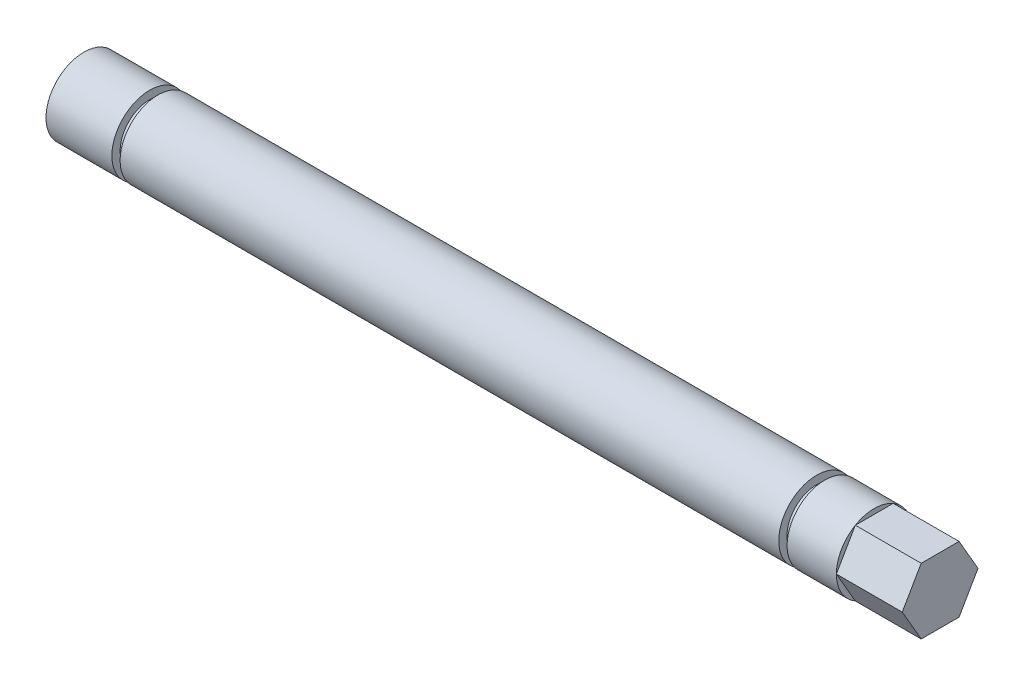
ISO-10303-21;
HEADER;
FILE_DESCRIPTION(('STEP AP214'),'2;1');
FILE_NAME('part.step','',(''),(''),'','','');
FILE_SCHEMA(('AUTOMOTIVE_DESIGN { 1 0 10303 214 1 1 1 1 }'));
ENDSEC;
DATA;
#1=APPLICATION_CONTEXT('core data for automotive mechanical design processes');
#2=APPLICATION_PROTOCOL_DEFINITION('international standard','automotive_design',2000,#1);
#3=PRODUCT_CONTEXT('',#1,'mechanical');
#4=PRODUCT('Part','Part','',(#3));
#5=PRODUCT_RELATED_PRODUCT_CATEGORY('part','',(#4));
#6=PRODUCT_DEFINITION_FORMATION('','',#4);
#7=PRODUCT_DEFINITION_CONTEXT('part definition',#1,'design');
#8=PRODUCT_DEFINITION('design','',#6,#7);
#9=PRODUCT_DEFINITION_SHAPE('','',#8);
#10=(LENGTH_UNIT() NAMED_UNIT(*) SI_UNIT(.MILLI.,.METRE.));
#11=(NAMED_UNIT(*) PLANE_ANGLE_UNIT() SI_UNIT($,.RADIAN.));
#12=(NAMED_UNIT(*) SI_UNIT($,.STERADIAN.) SOLID_ANGLE_UNIT());
#13=UNCERTAINTY_MEASURE_WITH_UNIT(LENGTH_MEASURE(1.E-05),#10,'distance_accuracy_value','');
#14=(GEOMETRIC_REPRESENTATION_CONTEXT(3) GLOBAL_UNCERTAINTY_ASSIGNED_CONTEXT((#13)) GLOBAL_UNIT_ASSIGNED_CONTEXT((#10,
#11,#12)) REPRESENTATION_CONTEXT('',''));
#15=CARTESIAN_POINT('',(0.,0.,0.));
#16=DIRECTION('',(0.,0.,1.));
#17=DIRECTION('',(1.,0.,0.));
#18=AXIS2_PLACEMENT_3D('',#15,#16,#17);
#19=CARTESIAN_POINT('',(165.1,0.,0.));
#20=DIRECTION('',(-1.,0.,0.));
#21=DIRECTION('',(0.,0.,1.));
#22=AXIS2_PLACEMENT_3D('',#19,#20,#21);
#23=CYLINDRICAL_SURFACE('',#22,7.3025);
#24=CARTESIAN_POINT('',(142.8877,0.,0.));
#25=DIRECTION('',(-1.,0.,0.));
#26=DIRECTION('',(0.,0.,1.));
#27=AXIS2_PLACEMENT_3D('',#24,#25,#26);
#28=CIRCLE('',#27,7.3025);
#29=CARTESIAN_POINT('',(142.8877,0.,7.3025));
#30=VERTEX_POINT('',#29);
#31=EDGE_CURVE('E146',#30,#30,#28,.T.);
#32=ORIENTED_EDGE('',*,*,#31,.F.);
#33=EDGE_LOOP('',(#32));
#34=FACE_BOUND('',#33,.T.);
#35=CARTESIAN_POINT('',(152.4,0.,0.));
#36=DIRECTION('',(1.,0.,0.));
#37=DIRECTION('',(0.,0.,-1.));
#38=AXIS2_PLACEMENT_3D('',#35,#36,#37);
#39=CIRCLE('',#38,7.3025);
#40=CARTESIAN_POINT('',(152.4,0.,-7.3025));
#41=VERTEX_POINT('',#40);
#42=CARTESIAN_POINT('',(152.4,6.32415051113586,-3.65125));
#43=VERTEX_POINT('',#42);
#44=EDGE_CURVE('E12',#41,#43,#39,.T.);
#45=ORIENTED_EDGE('',*,*,#44,.F.);
#46=CARTESIAN_POINT('',(152.4,-6.32415051113586,-3.65125));
#47=VERTEX_POINT('',#46);
#48=EDGE_CURVE('E44',#47,#41,#39,.T.);
#49=ORIENTED_EDGE('',*,*,#48,.F.);
#50=CARTESIAN_POINT('',(152.4,-6.32415051113586,3.65125));
#51=VERTEX_POINT('',#50);
#52=EDGE_CURVE('E97',#51,#47,#39,.T.);
#53=ORIENTED_EDGE('',*,*,#52,.F.);
#54=CARTESIAN_POINT('',(152.4,0.,7.3025));
#55=VERTEX_POINT('',#54);
#56=EDGE_CURVE('E129',#55,#51,#39,.T.);
#57=ORIENTED_EDGE('',*,*,#56,.F.);
#58=CARTESIAN_POINT('',(152.4,6.32415051113586,3.65125));
#59=VERTEX_POINT('',#58);
#60=EDGE_CURVE('E125',#59,#55,#39,.T.);
#61=ORIENTED_EDGE('',*,*,#60,.F.);
#62=EDGE_CURVE('E39',#43,#59,#39,.T.);
#63=ORIENTED_EDGE('',*,*,#62,.F.);
#64=EDGE_LOOP('',(#45,#49,#53,#57,#61,#63));
#65=FACE_BOUND('',#64,.T.);
#66=ADVANCED_FACE('F35',(#34,#65),#23,.T.);
#67=CARTESIAN_POINT('',(0.,0.,0.));
#68=DIRECTION('',(1.,0.,0.));
#69=DIRECTION('',(0.,0.,-1.));
#70=AXIS2_PLACEMENT_3D('',#67,#68,#69);
#71=CIRCLE('',#70,7.3025);
#72=CARTESIAN_POINT('',(0.,0.,-7.3025));
#73=VERTEX_POINT('',#72);
#74=EDGE_CURVE('E128',#73,#73,#71,.T.);
#75=ORIENTED_EDGE('',*,*,#74,.T.);
#76=EDGE_LOOP('',(#75));
#77=FACE_BOUND('',#76,.T.);
#78=CARTESIAN_POINT('',(12.7,0.,0.));
#79=DIRECTION('',(-1.,0.,0.));
#80=DIRECTION('',(0.,0.,1.));
#81=AXIS2_PLACEMENT_3D('',#78,#79,#80);
#82=CIRCLE('',#81,7.3025);
#83=CARTESIAN_POINT('',(12.7,0.,7.3025));
#84=VERTEX_POINT('',#83);
#85=EDGE_CURVE('E143',#84,#84,#82,.T.);
#86=ORIENTED_EDGE('',*,*,#85,.T.);
#87=EDGE_LOOP('',(#86));
#88=FACE_BOUND('',#87,.T.);
#89=ADVANCED_FACE('F37',(#77,#88),#23,.T.);
#90=CARTESIAN_POINT('',(0.,0.,0.));
#91=DIRECTION('',(1.,0.,0.));
#92=DIRECTION('',(0.,0.,-1.));
#93=AXIS2_PLACEMENT_3D('',#90,#91,#92);
#94=PLANE('',#93);
#95=ORIENTED_EDGE('',*,*,#74,.F.);
#96=EDGE_LOOP('',(#95));
#97=FACE_BOUND('',#96,.T.);
#98=ADVANCED_FACE('F207',(#97),#94,.F.);
#99=CARTESIAN_POINT('',(12.7,7.3025,0.));
#100=DIRECTION('',(1.,0.,0.));
#101=DIRECTION('',(0.,0.,-1.));
#102=AXIS2_PLACEMENT_3D('',#99,#100,#101);
#103=PLANE('',#102);
#104=CARTESIAN_POINT('',(12.7,0.,0.));
#105=DIRECTION('',(-1.,0.,0.));
#106=DIRECTION('',(0.,0.,1.));
#107=AXIS2_PLACEMENT_3D('',#104,#105,#106);
#108=CIRCLE('',#107,5.715);
#109=CARTESIAN_POINT('',(12.7,0.,5.715));
#110=VERTEX_POINT('',#109);
#111=EDGE_CURVE('E131',#110,#110,#108,.T.);
#112=ORIENTED_EDGE('',*,*,#111,.T.);
#113=EDGE_LOOP('',(#112));
#114=FACE_BOUND('',#113,.T.);
#115=ORIENTED_EDGE('',*,*,#85,.F.);
#116=EDGE_LOOP('',(#115));
#117=FACE_BOUND('',#116,.T.);
#118=ADVANCED_FACE('F231',(#114,#117),#103,.T.);
#119=CARTESIAN_POINT('',(0.,0.,0.));
#120=DIRECTION('',(-1.,0.,0.));
#121=DIRECTION('',(0.,0.,1.));
#122=AXIS2_PLACEMENT_3D('',#119,#120,#121);
#123=CYLINDRICAL_SURFACE('',#122,5.715);
#124=CARTESIAN_POINT('',(14.2875,0.,0.));
#125=DIRECTION('',(-1.,0.,0.));
#126=DIRECTION('',(0.,0.,1.));
#127=AXIS2_PLACEMENT_3D('',#124,#125,#126);
#128=CIRCLE('',#127,5.715);
#129=CARTESIAN_POINT('',(14.2875,0.,5.715));
#130=VERTEX_POINT('',#129);
#131=EDGE_CURVE('E135',#130,#130,#128,.T.);
#132=ORIENTED_EDGE('',*,*,#131,.T.);
#133=EDGE_LOOP('',(#132));
#134=FACE_BOUND('',#133,.T.);
#135=ORIENTED_EDGE('',*,*,#111,.F.);
#136=EDGE_LOOP('',(#135));
#137=FACE_BOUND('',#136,.T.);
#138=ADVANCED_FACE('F220',(#134,#137),#123,.T.);
#139=CARTESIAN_POINT('',(14.2875,7.3025,0.));
#140=DIRECTION('',(-1.,0.,0.));
#141=DIRECTION('',(0.,0.,1.));
#142=AXIS2_PLACEMENT_3D('',#139,#140,#141);
#143=PLANE('',#142);
#144=CARTESIAN_POINT('',(14.2875,0.,0.));
#145=DIRECTION('',(-1.,0.,0.));
#146=DIRECTION('',(0.,0.,1.));
#147=AXIS2_PLACEMENT_3D('',#144,#145,#146);
#148=CIRCLE('',#147,7.3025);
#149=CARTESIAN_POINT('',(14.2875,0.,7.3025));
#150=VERTEX_POINT('',#149);
#151=EDGE_CURVE('E140',#150,#150,#148,.T.);
#152=ORIENTED_EDGE('',*,*,#151,.T.);
#153=EDGE_LOOP('',(#152));
#154=FACE_BOUND('',#153,.T.);
#155=ORIENTED_EDGE('',*,*,#131,.F.);
#156=EDGE_LOOP('',(#155));
#157=FACE_BOUND('',#156,.T.);
#158=ADVANCED_FACE('F211',(#154,#157),#143,.T.);
#159=CARTESIAN_POINT('',(141.2875,0.,0.));
#160=DIRECTION('',(-1.,0.,0.));
#161=DIRECTION('',(0.,0.,1.));
#162=AXIS2_PLACEMENT_3D('',#159,#160,#161);
#163=CIRCLE('',#162,7.3025);
#164=CARTESIAN_POINT('',(141.2875,0.,7.3025));
#165=VERTEX_POINT('',#164);
#166=EDGE_CURVE('E147',#165,#165,#163,.T.);
#167=ORIENTED_EDGE('',*,*,#166,.T.);
#168=EDGE_LOOP('',(#167));
#169=FACE_BOUND('',#168,.T.);
#170=ORIENTED_EDGE('',*,*,#151,.F.);
#171=EDGE_LOOP('',(#170));
#172=FACE_BOUND('',#171,.T.);
#173=ADVANCED_FACE('F203',(#169,#172),#23,.T.);
#174=CARTESIAN_POINT('',(142.8877,0.,0.));
#175=DIRECTION('',(-1.,0.,0.));
#176=DIRECTION('',(0.,0.,1.));
#177=AXIS2_PLACEMENT_3D('',#174,#175,#176);
#178=PLANE('',#177);
#179=CARTESIAN_POINT('',(142.8877,0.,0.));
#180=DIRECTION('',(-1.,0.,0.));
#181=DIRECTION('',(0.,0.,1.));
#182=AXIS2_PLACEMENT_3D('',#179,#180,#181);
#183=CIRCLE('',#182,5.715);
#184=CARTESIAN_POINT('',(142.8877,0.,5.715));
#185=VERTEX_POINT('',#184);
#186=EDGE_CURVE('E150',#185,#185,#183,.T.);
#187=ORIENTED_EDGE('',*,*,#186,.F.);
#188=EDGE_LOOP('',(#187));
#189=FACE_BOUND('',#188,.T.);
#190=ORIENTED_EDGE('',*,*,#31,.T.);
#191=EDGE_LOOP('',(#190));
#192=FACE_BOUND('',#191,.T.);
#193=ADVANCED_FACE('F210',(#189,#192),#178,.T.);
#194=CARTESIAN_POINT('',(141.2875,0.,0.));
#195=DIRECTION('',(-1.,0.,0.));
#196=DIRECTION('',(0.,0.,1.));
#197=AXIS2_PLACEMENT_3D('',#194,#195,#196);
#198=PLANE('',#197);
#199=CARTESIAN_POINT('',(141.2875,0.,0.));
#200=DIRECTION('',(-1.,0.,0.));
#201=DIRECTION('',(0.,0.,1.));
#202=AXIS2_PLACEMENT_3D('',#199,#200,#201);
#203=CIRCLE('',#202,5.715);
#204=CARTESIAN_POINT('',(141.2875,0.,5.715));
#205=VERTEX_POINT('',#204);
#206=EDGE_CURVE('E153',#205,#205,#203,.T.);
#207=ORIENTED_EDGE('',*,*,#206,.T.);
#208=EDGE_LOOP('',(#207));
#209=FACE_BOUND('',#208,.T.);
#210=ORIENTED_EDGE('',*,*,#166,.F.);
#211=EDGE_LOOP('',(#210));
#212=FACE_BOUND('',#211,.T.);
#213=ADVANCED_FACE('F217',(#209,#212),#198,.F.);
#214=CARTESIAN_POINT('',(142.8877,0.,0.));
#215=DIRECTION('',(-1.,0.,0.));
#216=DIRECTION('',(0.,0.,1.));
#217=AXIS2_PLACEMENT_3D('',#214,#215,#216);
#218=CYLINDRICAL_SURFACE('',#217,5.715);
#219=ORIENTED_EDGE('',*,*,#186,.T.);
#220=EDGE_LOOP('',(#219));
#221=FACE_BOUND('',#220,.T.);
#222=ORIENTED_EDGE('',*,*,#206,.F.);
#223=EDGE_LOOP('',(#222));
#224=FACE_BOUND('',#223,.T.);
#225=ADVANCED_FACE('F198',(#221,#224),#218,.T.);
#226=CARTESIAN_POINT('',(152.4,0.,0.));
#227=DIRECTION('',(1.,0.,0.));
#228=DIRECTION('',(0.,0.,-1.));
#229=AXIS2_PLACEMENT_3D('',#226,#227,#228);
#230=PLANE('',#229);
#231=ORIENTED_EDGE('',*,*,#44,.T.);
#232=DIRECTION('',(0.,0.866025403784438,0.5));
#233=VECTOR('',#232,1.);
#234=CARTESIAN_POINT('',(152.4,0.,-7.3025));
#235=LINE('',#234,#233);
#236=EDGE_CURVE('E104',#41,#43,#235,.T.);
#237=ORIENTED_EDGE('',*,*,#236,.F.);
#238=EDGE_LOOP('',(#231,#237));
#239=FACE_BOUND('',#238,.T.);
#240=ADVANCED_FACE('F114',(#239),#230,.T.);
#241=ORIENTED_EDGE('',*,*,#62,.T.);
#242=DIRECTION('',(0.,0.,1.));
#243=VECTOR('',#242,1.);
#244=CARTESIAN_POINT('',(152.4,6.32415051113586,-3.65125));
#245=LINE('',#244,#243);
#246=EDGE_CURVE('E116',#43,#59,#245,.T.);
#247=ORIENTED_EDGE('',*,*,#246,.F.);
#248=EDGE_LOOP('',(#241,#247));
#249=FACE_BOUND('',#248,.T.);
#250=ADVANCED_FACE('F188',(#249),#230,.T.);
#251=ORIENTED_EDGE('',*,*,#60,.T.);
#252=DIRECTION('',(0.,-0.866025403784439,0.5));
#253=VECTOR('',#252,1.);
#254=CARTESIAN_POINT('',(152.4,6.32415051113586,3.65125));
#255=LINE('',#254,#253);
#256=EDGE_CURVE('E182',#59,#55,#255,.T.);
#257=ORIENTED_EDGE('',*,*,#256,.F.);
#258=EDGE_LOOP('',(#251,#257));
#259=FACE_BOUND('',#258,.T.);
#260=ADVANCED_FACE('F190',(#259),#230,.T.);
#261=ORIENTED_EDGE('',*,*,#56,.T.);
#262=DIRECTION('',(0.,-0.866025403784439,-0.5));
#263=VECTOR('',#262,1.);
#264=CARTESIAN_POINT('',(152.4,0.,7.3025));
#265=LINE('',#264,#263);
#266=EDGE_CURVE('E179',#55,#51,#265,.T.);
#267=ORIENTED_EDGE('',*,*,#266,.F.);
#268=EDGE_LOOP('',(#261,#267));
#269=FACE_BOUND('',#268,.T.);
#270=ADVANCED_FACE('F196',(#269),#230,.T.);
#271=ORIENTED_EDGE('',*,*,#52,.T.);
#272=DIRECTION('',(0.,0.,-1.));
#273=VECTOR('',#272,1.);
#274=CARTESIAN_POINT('',(152.4,-6.32415051113586,3.65125));
#275=LINE('',#274,#273);
#276=EDGE_CURVE('E51',#51,#47,#275,.T.);
#277=ORIENTED_EDGE('',*,*,#276,.F.);
#278=EDGE_LOOP('',(#271,#277));
#279=FACE_BOUND('',#278,.T.);
#280=ADVANCED_FACE('F257',(#279),#230,.T.);
#281=ORIENTED_EDGE('',*,*,#48,.T.);
#282=DIRECTION('',(0.,0.866025403784439,-0.5));
#283=VECTOR('',#282,1.);
#284=CARTESIAN_POINT('',(152.4,-6.32415051113586,-3.65125));
#285=LINE('',#284,#283);
#286=EDGE_CURVE('E92',#47,#41,#285,.T.);
#287=ORIENTED_EDGE('',*,*,#286,.F.);
#288=EDGE_LOOP('',(#281,#287));
#289=FACE_BOUND('',#288,.T.);
#290=ADVANCED_FACE('F90',(#289),#230,.T.);
#291=CARTESIAN_POINT('',(152.4,-6.32415051113586,-3.65125));
#292=DIRECTION('',(0.,-0.5,-0.866025403784439));
#293=DIRECTION('',(0.,0.866025403784439,-0.5));
#294=AXIS2_PLACEMENT_3D('',#291,#292,#293);
#295=PLANE('',#294);
#296=DIRECTION('',(0.,0.866025403784439,-0.5));
#297=VECTOR('',#296,1.);
#298=CARTESIAN_POINT('',(165.1,-6.32415051113586,-3.65125));
#299=LINE('',#298,#297);
#300=CARTESIAN_POINT('',(165.1,-6.32415051113586,-3.65125));
#301=VERTEX_POINT('',#300);
#302=CARTESIAN_POINT('',(165.1,0.,-7.3025));
#303=VERTEX_POINT('',#302);
#304=EDGE_CURVE('E176',#301,#303,#299,.T.);
#305=ORIENTED_EDGE('',*,*,#304,.F.);
#306=DIRECTION('',(1.,0.,0.));
#307=VECTOR('',#306,1.);
#308=CARTESIAN_POINT('',(152.4,-6.32415051113586,-3.65125));
#309=LINE('',#308,#307);
#310=EDGE_CURVE('E119',#47,#301,#309,.T.);
#311=ORIENTED_EDGE('',*,*,#310,.F.);
#312=ORIENTED_EDGE('',*,*,#286,.T.);
#313=DIRECTION('',(1.,0.,0.));
#314=VECTOR('',#313,1.);
#315=CARTESIAN_POINT('',(152.4,0.,-7.3025));
#316=LINE('',#315,#314);
#317=EDGE_CURVE('E101',#41,#303,#316,.T.);
#318=ORIENTED_EDGE('',*,*,#317,.T.);
#319=EDGE_LOOP('',(#305,#311,#312,#318));
#320=FACE_BOUND('',#319,.T.);
#321=ADVANCED_FACE('F118',(#320),#295,.T.);
#322=CARTESIAN_POINT('',(152.4,-6.32415051113586,3.65125));
#323=DIRECTION('',(0.,-1.,0.));
#324=DIRECTION('',(0.,0.,-1.));
#325=AXIS2_PLACEMENT_3D('',#322,#323,#324);
#326=PLANE('',#325);
#327=DIRECTION('',(0.,0.,-1.));
#328=VECTOR('',#327,1.);
#329=CARTESIAN_POINT('',(165.1,-6.32415051113586,3.65125));
#330=LINE('',#329,#328);
#331=CARTESIAN_POINT('',(165.1,-6.32415051113586,3.65125));
#332=VERTEX_POINT('',#331);
#333=EDGE_CURVE('E121',#332,#301,#330,.T.);
#334=ORIENTED_EDGE('',*,*,#333,.F.);
#335=DIRECTION('',(1.,0.,0.));
#336=VECTOR('',#335,1.);
#337=CARTESIAN_POINT('',(152.4,-6.32415051113586,3.65125));
#338=LINE('',#337,#336);
#339=EDGE_CURVE('E163',#51,#332,#338,.T.);
#340=ORIENTED_EDGE('',*,*,#339,.F.);
#341=ORIENTED_EDGE('',*,*,#276,.T.);
#342=ORIENTED_EDGE('',*,*,#310,.T.);
#343=EDGE_LOOP('',(#334,#340,#341,#342));
#344=FACE_BOUND('',#343,.T.);
#345=ADVANCED_FACE('F254',(#344),#326,.T.);
#346=CARTESIAN_POINT('',(152.4,0.,7.3025));
#347=DIRECTION('',(0.,-0.5,0.866025403784439));
#348=DIRECTION('',(0.,-0.866025403784439,-0.5));
#349=AXIS2_PLACEMENT_3D('',#346,#347,#348);
#350=PLANE('',#349);
#351=DIRECTION('',(0.,-0.866025403784439,-0.5));
#352=VECTOR('',#351,1.);
#353=CARTESIAN_POINT('',(165.1,0.,7.3025));
#354=LINE('',#353,#352);
#355=CARTESIAN_POINT('',(165.1,0.,7.3025));
#356=VERTEX_POINT('',#355);
#357=EDGE_CURVE('E168',#356,#332,#354,.T.);
#358=ORIENTED_EDGE('',*,*,#357,.F.);
#359=DIRECTION('',(1.,0.,0.));
#360=VECTOR('',#359,1.);
#361=CARTESIAN_POINT('',(152.4,0.,7.3025));
#362=LINE('',#361,#360);
#363=EDGE_CURVE('E161',#55,#356,#362,.T.);
#364=ORIENTED_EDGE('',*,*,#363,.F.);
#365=ORIENTED_EDGE('',*,*,#266,.T.);
#366=ORIENTED_EDGE('',*,*,#339,.T.);
#367=EDGE_LOOP('',(#358,#364,#365,#366));
#368=FACE_BOUND('',#367,.T.);
#369=ADVANCED_FACE('F260',(#368),#350,.T.);
#370=CARTESIAN_POINT('',(152.4,6.32415051113586,3.65125));
#371=DIRECTION('',(0.,0.5,0.866025403784439));
#372=DIRECTION('',(0.,-0.866025403784439,0.5));
#373=AXIS2_PLACEMENT_3D('',#370,#371,#372);
#374=PLANE('',#373);
#375=DIRECTION('',(0.,-0.866025403784439,0.5));
#376=VECTOR('',#375,1.);
#377=CARTESIAN_POINT('',(165.1,6.32415051113586,3.65125));
#378=LINE('',#377,#376);
#379=CARTESIAN_POINT('',(165.1,6.32415051113586,3.65125));
#380=VERTEX_POINT('',#379);
#381=EDGE_CURVE('E171',#380,#356,#378,.T.);
#382=ORIENTED_EDGE('',*,*,#381,.F.);
#383=DIRECTION('',(1.,0.,0.));
#384=VECTOR('',#383,1.);
#385=CARTESIAN_POINT('',(152.4,6.32415051113586,3.65125));
#386=LINE('',#385,#384);
#387=EDGE_CURVE('E159',#59,#380,#386,.T.);
#388=ORIENTED_EDGE('',*,*,#387,.F.);
#389=ORIENTED_EDGE('',*,*,#256,.T.);
#390=ORIENTED_EDGE('',*,*,#363,.T.);
#391=EDGE_LOOP('',(#382,#388,#389,#390));
#392=FACE_BOUND('',#391,.T.);
#393=ADVANCED_FACE('F279',(#392),#374,.T.);
#394=CARTESIAN_POINT('',(152.4,6.32415051113586,-3.65125));
#395=DIRECTION('',(0.,1.,0.));
#396=DIRECTION('',(0.,0.,1.));
#397=AXIS2_PLACEMENT_3D('',#394,#395,#396);
#398=PLANE('',#397);
#399=DIRECTION('',(0.,0.,1.));
#400=VECTOR('',#399,1.);
#401=CARTESIAN_POINT('',(165.1,6.32415051113586,-3.65125));
#402=LINE('',#401,#400);
#403=CARTESIAN_POINT('',(165.1,6.32415051113587,-3.65125));
#404=VERTEX_POINT('',#403);
#405=EDGE_CURVE('E59',#404,#380,#402,.T.);
#406=ORIENTED_EDGE('',*,*,#405,.F.);
#407=DIRECTION('',(1.,0.,0.));
#408=VECTOR('',#407,1.);
#409=CARTESIAN_POINT('',(152.4,6.32415051113586,-3.65125));
#410=LINE('',#409,#408);
#411=EDGE_CURVE('E111',#43,#404,#410,.T.);
#412=ORIENTED_EDGE('',*,*,#411,.F.);
#413=ORIENTED_EDGE('',*,*,#246,.T.);
#414=ORIENTED_EDGE('',*,*,#387,.T.);
#415=EDGE_LOOP('',(#406,#412,#413,#414));
#416=FACE_BOUND('',#415,.T.);
#417=ADVANCED_FACE('F186',(#416),#398,.T.);
#418=CARTESIAN_POINT('',(152.4,0.,-7.3025));
#419=DIRECTION('',(0.,0.5,-0.866025403784438));
#420=DIRECTION('',(0.,0.866025403784439,0.5));
#421=AXIS2_PLACEMENT_3D('',#418,#419,#420);
#422=PLANE('',#421);
#423=DIRECTION('',(0.,0.866025403784438,0.5));
#424=VECTOR('',#423,1.);
#425=CARTESIAN_POINT('',(165.1,0.,-7.3025));
#426=LINE('',#425,#424);
#427=EDGE_CURVE('E107',#303,#404,#426,.T.);
#428=ORIENTED_EDGE('',*,*,#427,.F.);
#429=ORIENTED_EDGE('',*,*,#317,.F.);
#430=ORIENTED_EDGE('',*,*,#236,.T.);
#431=ORIENTED_EDGE('',*,*,#411,.T.);
#432=EDGE_LOOP('',(#428,#429,#430,#431));
#433=FACE_BOUND('',#432,.T.);
#434=ADVANCED_FACE('F103',(#433),#422,.T.);
#435=CARTESIAN_POINT('',(165.1,0.,0.));
#436=DIRECTION('',(1.,0.,0.));
#437=DIRECTION('',(0.,0.,-1.));
#438=AXIS2_PLACEMENT_3D('',#435,#436,#437);
#439=PLANE('',#438);
#440=ORIENTED_EDGE('',*,*,#333,.T.);
#441=ORIENTED_EDGE('',*,*,#304,.T.);
#442=ORIENTED_EDGE('',*,*,#427,.T.);
#443=ORIENTED_EDGE('',*,*,#405,.T.);
#444=ORIENTED_EDGE('',*,*,#381,.T.);
#445=ORIENTED_EDGE('',*,*,#357,.T.);
#446=EDGE_LOOP('',(#440,#441,#442,#443,#444,#445));
#447=FACE_BOUND('',#446,.T.);
#448=ADVANCED_FACE('F245',(#447),#439,.T.);
#449=CLOSED_SHELL('',(#66,#89,#98,#118,#138,#158,#173,#193,#213,#225,#240,#250,#260,#270,#280,
#290,#321,#345,#369,#393,#417,#434,#448));
#450=MANIFOLD_SOLID_BREP('B2',#449);
#451=ADVANCED_BREP_SHAPE_REPRESENTATION('',(#18,#450),#14);
#452=SHAPE_DEFINITION_REPRESENTATION(#9,#451);
ENDSEC;
END-ISO-10303-21;
